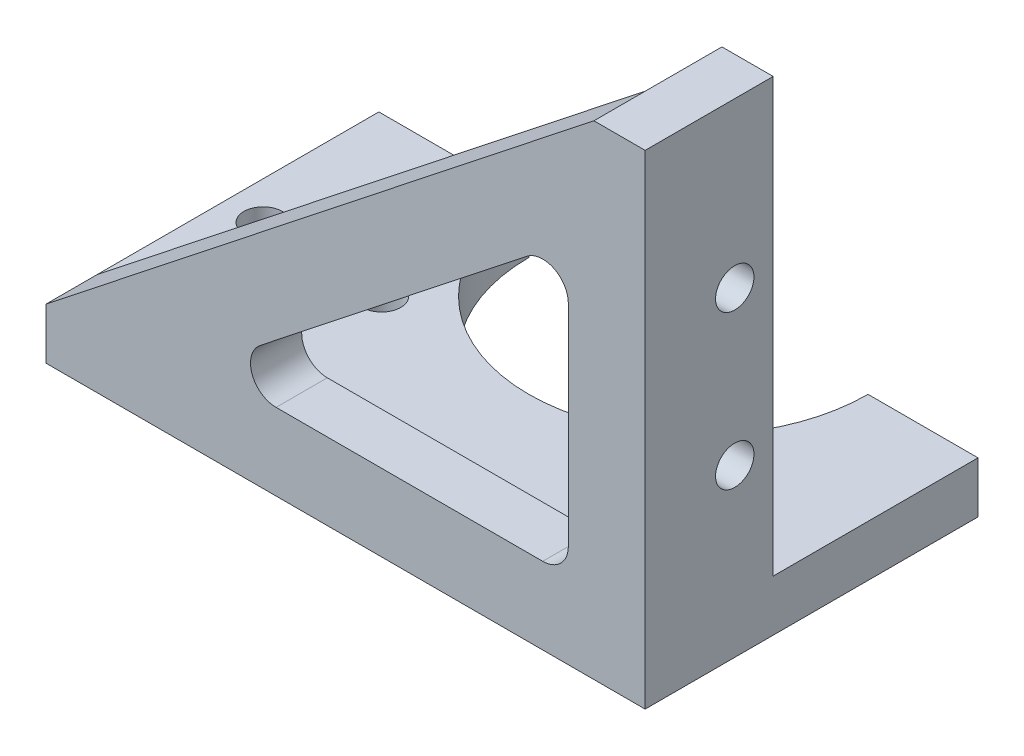
ISO-10303-21;
HEADER;
FILE_DESCRIPTION(('STEP AP214'),'2;1');
FILE_NAME('part.step','',(''),(''),'','','');
FILE_SCHEMA(('AUTOMOTIVE_DESIGN { 1 0 10303 214 1 1 1 1 }'));
ENDSEC;
DATA;
#1=APPLICATION_CONTEXT('core data for automotive mechanical design processes');
#2=APPLICATION_PROTOCOL_DEFINITION('international standard','automotive_design',2000,#1);
#3=PRODUCT_CONTEXT('',#1,'mechanical');
#4=PRODUCT('Part','Part','',(#3));
#5=PRODUCT_RELATED_PRODUCT_CATEGORY('part','',(#4));
#6=PRODUCT_DEFINITION_FORMATION('','',#4);
#7=PRODUCT_DEFINITION_CONTEXT('part definition',#1,'design');
#8=PRODUCT_DEFINITION('design','',#6,#7);
#9=PRODUCT_DEFINITION_SHAPE('','',#8);
#10=(LENGTH_UNIT() NAMED_UNIT(*) SI_UNIT(.MILLI.,.METRE.));
#11=(NAMED_UNIT(*) PLANE_ANGLE_UNIT() SI_UNIT($,.RADIAN.));
#12=(NAMED_UNIT(*) SI_UNIT($,.STERADIAN.) SOLID_ANGLE_UNIT());
#13=UNCERTAINTY_MEASURE_WITH_UNIT(LENGTH_MEASURE(1.E-05),#10,'distance_accuracy_value','');
#14=(GEOMETRIC_REPRESENTATION_CONTEXT(3) GLOBAL_UNCERTAINTY_ASSIGNED_CONTEXT((#13)) GLOBAL_UNIT_ASSIGNED_CONTEXT((#10,
#11,#12)) REPRESENTATION_CONTEXT('',''));
#15=CARTESIAN_POINT('',(0.,0.,0.));
#16=DIRECTION('',(0.,0.,1.));
#17=DIRECTION('',(1.,0.,0.));
#18=AXIS2_PLACEMENT_3D('',#15,#16,#17);
#19=CARTESIAN_POINT('',(0.,0.,0.));
#20=DIRECTION('',(0.,0.,-1.));
#21=DIRECTION('',(-1.,0.,0.));
#22=AXIS2_PLACEMENT_3D('',#19,#20,#21);
#23=PLANE('',#22);
#24=DIRECTION('',(0.,1.,0.));
#25=VECTOR('',#24,1.);
#26=CARTESIAN_POINT('',(-11.69,-2.,0.));
#27=LINE('',#26,#25);
#28=CARTESIAN_POINT('',(-11.69,-2.,0.));
#29=VERTEX_POINT('',#28);
#30=CARTESIAN_POINT('',(-11.69,2.,0.));
#31=VERTEX_POINT('',#30);
#32=EDGE_CURVE('E201',#29,#31,#27,.T.);
#33=ORIENTED_EDGE('',*,*,#32,.F.);
#34=DIRECTION('',(1.,0.,0.));
#35=VECTOR('',#34,1.);
#36=CARTESIAN_POINT('',(23.4,-2.,0.));
#37=LINE('',#36,#35);
#38=CARTESIAN_POINT('',(-23.4,-2.,0.));
#39=VERTEX_POINT('',#38);
#40=EDGE_CURVE('E321',#39,#29,#37,.T.);
#41=ORIENTED_EDGE('',*,*,#40,.F.);
#42=DIRECTION('',(0.,-1.,0.));
#43=VECTOR('',#42,1.);
#44=CARTESIAN_POINT('',(-23.4,-2.,0.));
#45=LINE('',#44,#43);
#46=CARTESIAN_POINT('',(-23.4,2.,0.));
#47=VERTEX_POINT('',#46);
#48=EDGE_CURVE('E311',#47,#39,#45,.T.);
#49=ORIENTED_EDGE('',*,*,#48,.F.);
#50=DIRECTION('',(-1.,0.,0.));
#51=VECTOR('',#50,1.);
#52=CARTESIAN_POINT('',(-16.4,2.,0.));
#53=LINE('',#52,#51);
#54=EDGE_CURVE('E325',#31,#47,#53,.T.);
#55=ORIENTED_EDGE('',*,*,#54,.F.);
#56=EDGE_LOOP('',(#33,#41,#49,#55));
#57=FACE_BOUND('',#56,.T.);
#58=ADVANCED_FACE('F34',(#57),#23,.T.);
#59=CARTESIAN_POINT('',(19.4,35.8,26.));
#60=DIRECTION('',(1.,0.,0.));
#61=DIRECTION('',(0.,1.,0.));
#62=AXIS2_PLACEMENT_3D('',#59,#60,#61);
#63=PLANE('',#62);
#64=CARTESIAN_POINT('',(19.4,23.,19.));
#65=DIRECTION('',(-1.,0.,0.));
#66=DIRECTION('',(0.,-1.,0.));
#67=AXIS2_PLACEMENT_3D('',#64,#65,#66);
#68=CIRCLE('',#67,1.5);
#69=CARTESIAN_POINT('',(19.4,21.5,19.));
#70=VERTEX_POINT('',#69);
#71=EDGE_CURVE('E207',#70,#70,#68,.T.);
#72=ORIENTED_EDGE('',*,*,#71,.F.);
#73=EDGE_LOOP('',(#72));
#74=FACE_BOUND('',#73,.T.);
#75=CARTESIAN_POINT('',(19.4,11.,19.));
#76=DIRECTION('',(-1.,0.,0.));
#77=DIRECTION('',(0.,-1.,0.));
#78=AXIS2_PLACEMENT_3D('',#75,#76,#77);
#79=CIRCLE('',#78,1.5);
#80=CARTESIAN_POINT('',(19.4,9.50000000000001,19.));
#81=VERTEX_POINT('',#80);
#82=EDGE_CURVE('E249',#81,#81,#79,.T.);
#83=ORIENTED_EDGE('',*,*,#82,.F.);
#84=EDGE_LOOP('',(#83));
#85=FACE_BOUND('',#84,.T.);
#86=DIRECTION('',(0.,0.,-1.));
#87=VECTOR('',#86,1.);
#88=CARTESIAN_POINT('',(19.4,35.8,26.));
#89=LINE('',#88,#87);
#90=CARTESIAN_POINT('',(19.4,35.8,22.));
#91=VERTEX_POINT('',#90);
#92=CARTESIAN_POINT('',(19.4,35.8,16.));
#93=VERTEX_POINT('',#92);
#94=EDGE_CURVE('E167',#91,#93,#89,.T.);
#95=ORIENTED_EDGE('',*,*,#94,.T.);
#96=DIRECTION('',(0.,1.,0.));
#97=VECTOR('',#96,1.);
#98=CARTESIAN_POINT('',(19.4,35.8,16.));
#99=LINE('',#98,#97);
#100=CARTESIAN_POINT('',(19.4,2.,16.));
#101=VERTEX_POINT('',#100);
#102=EDGE_CURVE('E150',#101,#93,#99,.T.);
#103=ORIENTED_EDGE('',*,*,#102,.F.);
#104=DIRECTION('',(0.,0.,-1.));
#105=VECTOR('',#104,1.);
#106=CARTESIAN_POINT('',(19.4,2.,26.));
#107=LINE('',#106,#105);
#108=CARTESIAN_POINT('',(19.4,2.,22.));
#109=VERTEX_POINT('',#108);
#110=EDGE_CURVE('E165',#109,#101,#107,.T.);
#111=ORIENTED_EDGE('',*,*,#110,.F.);
#112=DIRECTION('',(0.,1.,0.));
#113=VECTOR('',#112,1.);
#114=CARTESIAN_POINT('',(19.4,35.8,22.));
#115=LINE('',#114,#113);
#116=EDGE_CURVE('E306',#109,#91,#115,.T.);
#117=ORIENTED_EDGE('',*,*,#116,.T.);
#118=EDGE_LOOP('',(#95,#103,#111,#117));
#119=FACE_BOUND('',#118,.T.);
#120=ADVANCED_FACE('F163',(#74,#85,#119),#63,.F.);
#121=CARTESIAN_POINT('',(-16.4,2.,26.));
#122=DIRECTION('',(0.,-1.,0.));
#123=DIRECTION('',(0.,0.,-1.));
#124=AXIS2_PLACEMENT_3D('',#121,#122,#123);
#125=PLANE('',#124);
#126=CARTESIAN_POINT('',(-20.44,2.,12.));
#127=DIRECTION('',(0.,1.,0.));
#128=DIRECTION('',(-1.,0.,0.));
#129=AXIS2_PLACEMENT_3D('',#126,#127,#128);
#130=CIRCLE('',#129,1.5);
#131=CARTESIAN_POINT('',(-21.94,2.,12.));
#132=VERTEX_POINT('',#131);
#133=EDGE_CURVE('E286',#132,#132,#130,.T.);
#134=ORIENTED_EDGE('',*,*,#133,.F.);
#135=EDGE_LOOP('',(#134));
#136=FACE_BOUND('',#135,.T.);
#137=CARTESIAN_POINT('',(13.9343686707647,2.,12.3743686707644));
#138=DIRECTION('',(0.,1.,0.));
#139=DIRECTION('',(-1.,0.,0.));
#140=AXIS2_PLACEMENT_3D('',#137,#138,#139);
#141=CIRCLE('',#140,1.5);
#142=CARTESIAN_POINT('',(12.4343686707647,2.,12.3743686707644));
#143=VERTEX_POINT('',#142);
#144=EDGE_CURVE('E299',#143,#143,#141,.T.);
#145=ORIENTED_EDGE('',*,*,#144,.F.);
#146=EDGE_LOOP('',(#145));
#147=FACE_BOUND('',#146,.T.);
#148=CARTESIAN_POINT('',(-10.8143686707644,2.,12.3743686707647));
#149=DIRECTION('',(0.,1.,0.));
#150=DIRECTION('',(-1.,0.,0.));
#151=AXIS2_PLACEMENT_3D('',#148,#149,#150);
#152=CIRCLE('',#151,1.5);
#153=CARTESIAN_POINT('',(-12.3143686707644,2.,12.3743686707647));
#154=VERTEX_POINT('',#153);
#155=EDGE_CURVE('E281',#154,#154,#152,.T.);
#156=ORIENTED_EDGE('',*,*,#155,.F.);
#157=EDGE_LOOP('',(#156));
#158=FACE_BOUND('',#157,.T.);
#159=CARTESIAN_POINT('',(23.4,2.00000000000001,0.));
#160=VERTEX_POINT('',#159);
#161=CARTESIAN_POINT('',(14.81,2.,0.));
#162=VERTEX_POINT('',#161);
#163=EDGE_CURVE('E183',#160,#162,#53,.T.);
#164=ORIENTED_EDGE('',*,*,#163,.T.);
#165=CARTESIAN_POINT('',(1.55999999999998,2.,0.));
#166=DIRECTION('',(0.,1.,0.));
#167=DIRECTION('',(-1.,0.,0.));
#168=AXIS2_PLACEMENT_3D('',#165,#166,#167);
#169=CIRCLE('',#168,13.25);
#170=EDGE_CURVE('E293',#31,#162,#169,.T.);
#171=ORIENTED_EDGE('',*,*,#170,.F.);
#172=ORIENTED_EDGE('',*,*,#54,.T.);
#173=DIRECTION('',(0.,0.,-1.));
#174=VECTOR('',#173,1.);
#175=CARTESIAN_POINT('',(-23.4,2.,26.));
#176=LINE('',#175,#174);
#177=CARTESIAN_POINT('',(-23.4,2.,22.));
#178=VERTEX_POINT('',#177);
#179=EDGE_CURVE('E195',#178,#47,#176,.T.);
#180=ORIENTED_EDGE('',*,*,#179,.F.);
#181=DIRECTION('',(1.,0.,0.));
#182=VECTOR('',#181,1.);
#183=CARTESIAN_POINT('',(19.4,2.,22.));
#184=LINE('',#183,#182);
#185=EDGE_CURVE('E174',#178,#109,#184,.T.);
#186=ORIENTED_EDGE('',*,*,#185,.T.);
#187=ORIENTED_EDGE('',*,*,#110,.T.);
#188=DIRECTION('',(-1.,0.,0.));
#189=VECTOR('',#188,1.);
#190=CARTESIAN_POINT('',(29.4,2.00000000000001,16.));
#191=LINE('',#190,#189);
#192=CARTESIAN_POINT('',(23.4,2.,16.));
#193=VERTEX_POINT('',#192);
#194=EDGE_CURVE('E147',#193,#101,#191,.T.);
#195=ORIENTED_EDGE('',*,*,#194,.F.);
#196=DIRECTION('',(0.,0.,1.));
#197=VECTOR('',#196,1.);
#198=CARTESIAN_POINT('',(23.4,2.00000000000001,26.));
#199=LINE('',#198,#197);
#200=EDGE_CURVE('E277',#160,#193,#199,.T.);
#201=ORIENTED_EDGE('',*,*,#200,.F.);
#202=EDGE_LOOP('',(#164,#171,#172,#180,#186,#187,#195,#201));
#203=FACE_BOUND('',#202,.T.);
#204=ADVANCED_FACE('F172',(#136,#147,#158,#203),#125,.F.);
#205=CARTESIAN_POINT('',(-23.4,-2.,26.));
#206=DIRECTION('',(1.,0.,0.));
#207=DIRECTION('',(0.,0.,-1.));
#208=AXIS2_PLACEMENT_3D('',#205,#206,#207);
#209=PLANE('',#208);
#210=ORIENTED_EDGE('',*,*,#48,.T.);
#211=DIRECTION('',(0.,0.,-1.));
#212=VECTOR('',#211,1.);
#213=CARTESIAN_POINT('',(-23.4,-2.,26.));
#214=LINE('',#213,#212);
#215=CARTESIAN_POINT('',(-23.4,-2.,26.));
#216=VERTEX_POINT('',#215);
#217=EDGE_CURVE('E192',#216,#39,#214,.T.);
#218=ORIENTED_EDGE('',*,*,#217,.F.);
#219=DIRECTION('',(0.,-1.,0.));
#220=VECTOR('',#219,1.);
#221=CARTESIAN_POINT('',(-23.4,-2.,26.));
#222=LINE('',#221,#220);
#223=CARTESIAN_POINT('',(-23.4,2.,26.));
#224=VERTEX_POINT('',#223);
#225=EDGE_CURVE('E314',#224,#216,#222,.T.);
#226=ORIENTED_EDGE('',*,*,#225,.F.);
#227=EDGE_CURVE('E196',#224,#178,#176,.T.);
#228=ORIENTED_EDGE('',*,*,#227,.T.);
#229=ORIENTED_EDGE('',*,*,#179,.T.);
#230=EDGE_LOOP('',(#210,#218,#226,#228,#229));
#231=FACE_BOUND('',#230,.T.);
#232=ADVANCED_FACE('F347',(#231),#209,.F.);
#233=CARTESIAN_POINT('',(23.4,-2.,26.));
#234=DIRECTION('',(0.,1.,0.));
#235=DIRECTION('',(-1.,0.,0.));
#236=AXIS2_PLACEMENT_3D('',#233,#234,#235);
#237=PLANE('',#236);
#238=CARTESIAN_POINT('',(-20.44,-2.,12.));
#239=DIRECTION('',(0.,1.,0.));
#240=DIRECTION('',(-1.,0.,0.));
#241=AXIS2_PLACEMENT_3D('',#238,#239,#240);
#242=CIRCLE('',#241,1.5);
#243=CARTESIAN_POINT('',(-21.94,-2.,12.));
#244=VERTEX_POINT('',#243);
#245=EDGE_CURVE('E282',#244,#244,#242,.T.);
#246=ORIENTED_EDGE('',*,*,#245,.T.);
#247=EDGE_LOOP('',(#246));
#248=FACE_BOUND('',#247,.T.);
#249=CARTESIAN_POINT('',(13.9343686707647,-2.,12.3743686707644));
#250=DIRECTION('',(0.,1.,0.));
#251=DIRECTION('',(-1.,0.,0.));
#252=AXIS2_PLACEMENT_3D('',#249,#250,#251);
#253=CIRCLE('',#252,1.5);
#254=CARTESIAN_POINT('',(12.4343686707647,-2.,12.3743686707644));
#255=VERTEX_POINT('',#254);
#256=EDGE_CURVE('E289',#255,#255,#253,.T.);
#257=ORIENTED_EDGE('',*,*,#256,.T.);
#258=EDGE_LOOP('',(#257));
#259=FACE_BOUND('',#258,.T.);
#260=CARTESIAN_POINT('',(-10.8143686707644,-2.,12.3743686707647));
#261=DIRECTION('',(0.,1.,0.));
#262=DIRECTION('',(-1.,0.,0.));
#263=AXIS2_PLACEMENT_3D('',#260,#261,#262);
#264=CIRCLE('',#263,1.5);
#265=CARTESIAN_POINT('',(-12.3143686707644,-2.,12.3743686707647));
#266=VERTEX_POINT('',#265);
#267=EDGE_CURVE('E290',#266,#266,#264,.T.);
#268=ORIENTED_EDGE('',*,*,#267,.T.);
#269=EDGE_LOOP('',(#268));
#270=FACE_BOUND('',#269,.T.);
#271=ORIENTED_EDGE('',*,*,#40,.T.);
#272=CARTESIAN_POINT('',(1.55999999999998,-2.,0.));
#273=DIRECTION('',(0.,1.,0.));
#274=DIRECTION('',(-1.,0.,0.));
#275=AXIS2_PLACEMENT_3D('',#272,#273,#274);
#276=CIRCLE('',#275,13.25);
#277=CARTESIAN_POINT('',(14.81,-2.,0.));
#278=VERTEX_POINT('',#277);
#279=EDGE_CURVE('E296',#29,#278,#276,.T.);
#280=ORIENTED_EDGE('',*,*,#279,.T.);
#281=CARTESIAN_POINT('',(23.4,-2.,0.));
#282=VERTEX_POINT('',#281);
#283=EDGE_CURVE('E320',#278,#282,#37,.T.);
#284=ORIENTED_EDGE('',*,*,#283,.T.);
#285=DIRECTION('',(0.,0.,-1.));
#286=VECTOR('',#285,1.);
#287=CARTESIAN_POINT('',(23.4,-2.,26.));
#288=LINE('',#287,#286);
#289=CARTESIAN_POINT('',(23.4,-2.,26.));
#290=VERTEX_POINT('',#289);
#291=EDGE_CURVE('E189',#290,#282,#288,.T.);
#292=ORIENTED_EDGE('',*,*,#291,.F.);
#293=DIRECTION('',(1.,0.,0.));
#294=VECTOR('',#293,1.);
#295=CARTESIAN_POINT('',(23.4,-2.,26.));
#296=LINE('',#295,#294);
#297=EDGE_CURVE('E316',#216,#290,#296,.T.);
#298=ORIENTED_EDGE('',*,*,#297,.F.);
#299=ORIENTED_EDGE('',*,*,#217,.T.);
#300=EDGE_LOOP('',(#271,#280,#284,#292,#298,#299));
#301=FACE_BOUND('',#300,.T.);
#302=ADVANCED_FACE('F339',(#248,#259,#270,#301),#237,.F.);
#303=CARTESIAN_POINT('',(23.4,21.7284271247462,26.));
#304=DIRECTION('',(-1.,0.,0.));
#305=DIRECTION('',(0.,0.,1.));
#306=AXIS2_PLACEMENT_3D('',#303,#304,#305);
#307=PLANE('',#306);
#308=CARTESIAN_POINT('',(23.4,23.,19.));
#309=DIRECTION('',(-1.,0.,0.));
#310=DIRECTION('',(0.,0.,1.));
#311=AXIS2_PLACEMENT_3D('',#308,#309,#310);
#312=CIRCLE('',#311,1.5);
#313=CARTESIAN_POINT('',(23.4,23.,20.5));
#314=VERTEX_POINT('',#313);
#315=EDGE_CURVE('E168',#314,#314,#312,.T.);
#316=ORIENTED_EDGE('',*,*,#315,.T.);
#317=EDGE_LOOP('',(#316));
#318=FACE_BOUND('',#317,.T.);
#319=CARTESIAN_POINT('',(23.4,11.,19.));
#320=DIRECTION('',(-1.,0.,0.));
#321=DIRECTION('',(0.,0.,1.));
#322=AXIS2_PLACEMENT_3D('',#319,#320,#321);
#323=CIRCLE('',#322,1.5);
#324=CARTESIAN_POINT('',(23.4,11.,20.5));
#325=VERTEX_POINT('',#324);
#326=EDGE_CURVE('E204',#325,#325,#323,.T.);
#327=ORIENTED_EDGE('',*,*,#326,.T.);
#328=EDGE_LOOP('',(#327));
#329=FACE_BOUND('',#328,.T.);
#330=ORIENTED_EDGE('',*,*,#200,.T.);
#331=DIRECTION('',(0.,1.,0.));
#332=VECTOR('',#331,1.);
#333=CARTESIAN_POINT('',(23.4,21.7284271247462,16.));
#334=LINE('',#333,#332);
#335=CARTESIAN_POINT('',(23.4,35.8,16.));
#336=VERTEX_POINT('',#335);
#337=EDGE_CURVE('E153',#193,#336,#334,.T.);
#338=ORIENTED_EDGE('',*,*,#337,.T.);
#339=DIRECTION('',(0.,0.,-1.));
#340=VECTOR('',#339,1.);
#341=CARTESIAN_POINT('',(23.4,35.8,26.));
#342=LINE('',#341,#340);
#343=CARTESIAN_POINT('',(23.4,35.8,26.));
#344=VERTEX_POINT('',#343);
#345=EDGE_CURVE('E186',#344,#336,#342,.T.);
#346=ORIENTED_EDGE('',*,*,#345,.F.);
#347=DIRECTION('',(0.,1.,0.));
#348=VECTOR('',#347,1.);
#349=CARTESIAN_POINT('',(23.4,-2.,26.));
#350=LINE('',#349,#348);
#351=EDGE_CURVE('E180',#290,#344,#350,.T.);
#352=ORIENTED_EDGE('',*,*,#351,.F.);
#353=ORIENTED_EDGE('',*,*,#291,.T.);
#354=DIRECTION('',(0.,1.,0.));
#355=VECTOR('',#354,1.);
#356=CARTESIAN_POINT('',(23.4,21.7284271247462,0.));
#357=LINE('',#356,#355);
#358=EDGE_CURVE('E323',#282,#160,#357,.T.);
#359=ORIENTED_EDGE('',*,*,#358,.T.);
#360=EDGE_LOOP('',(#330,#338,#346,#352,#353,#359));
#361=FACE_BOUND('',#360,.T.);
#362=ADVANCED_FACE('F384',(#318,#329,#361),#307,.F.);
#363=CARTESIAN_POINT('',(23.4,35.8,26.));
#364=DIRECTION('',(0.,-1.,0.));
#365=DIRECTION('',(1.,0.,0.));
#366=AXIS2_PLACEMENT_3D('',#363,#364,#365);
#367=PLANE('',#366);
#368=ORIENTED_EDGE('',*,*,#345,.T.);
#369=DIRECTION('',(-1.,0.,0.));
#370=VECTOR('',#369,1.);
#371=CARTESIAN_POINT('',(29.4,35.8,16.));
#372=LINE('',#371,#370);
#373=EDGE_CURVE('E158',#336,#93,#372,.T.);
#374=ORIENTED_EDGE('',*,*,#373,.T.);
#375=ORIENTED_EDGE('',*,*,#94,.F.);
#376=CARTESIAN_POINT('',(19.4,35.8,26.));
#377=VERTEX_POINT('',#376);
#378=EDGE_CURVE('E177',#377,#91,#89,.T.);
#379=ORIENTED_EDGE('',*,*,#378,.F.);
#380=DIRECTION('',(-1.,0.,0.));
#381=VECTOR('',#380,1.);
#382=CARTESIAN_POINT('',(23.4,35.8,26.));
#383=LINE('',#382,#381);
#384=EDGE_CURVE('E175',#344,#377,#383,.T.);
#385=ORIENTED_EDGE('',*,*,#384,.F.);
#386=EDGE_LOOP('',(#368,#374,#375,#379,#385));
#387=FACE_BOUND('',#386,.T.);
#388=ADVANCED_FACE('F357',(#387),#367,.F.);
#389=CARTESIAN_POINT('',(0.,0.,26.));
#390=DIRECTION('',(0.,0.,-1.));
#391=DIRECTION('',(-1.,0.,0.));
#392=AXIS2_PLACEMENT_3D('',#389,#390,#391);
#393=PLANE('',#392);
#394=DIRECTION('',(1.,0.,0.));
#395=VECTOR('',#394,1.);
#396=CARTESIAN_POINT('',(17.4,4.,26.));
#397=LINE('',#396,#395);
#398=CARTESIAN_POINT('',(-5.42675504269587,4.,26.));
#399=VERTEX_POINT('',#398);
#400=CARTESIAN_POINT('',(15.4,4.,26.));
#401=VERTEX_POINT('',#400);
#402=EDGE_CURVE('E250',#399,#401,#397,.T.);
#403=ORIENTED_EDGE('',*,*,#402,.F.);
#404=CARTESIAN_POINT('',(-5.42675504269587,6.,26.));
#405=DIRECTION('',(0.,0.,-1.));
#406=DIRECTION('',(-1.,0.,0.));
#407=AXIS2_PLACEMENT_3D('',#404,#405,#406);
#408=CIRCLE('',#407,2.);
#409=CARTESIAN_POINT('',(-6.6662814128613,7.56957777050533,26.));
#410=VERTEX_POINT('',#409);
#411=EDGE_CURVE('E230',#399,#410,#408,.T.);
#412=ORIENTED_EDGE('',*,*,#411,.T.);
#413=DIRECTION('',(-0.784788885252669,-0.619763185082716,0.));
#414=VECTOR('',#413,1.);
#415=CARTESIAN_POINT('',(-11.186338471371,3.99999999999999,26.));
#416=LINE('',#415,#414);
#417=CARTESIAN_POINT('',(14.1604736298346,24.0168749771203,26.));
#418=VERTEX_POINT('',#417);
#419=EDGE_CURVE('E244',#418,#410,#416,.T.);
#420=ORIENTED_EDGE('',*,*,#419,.F.);
#421=CARTESIAN_POINT('',(15.4,22.447297206615,26.));
#422=DIRECTION('',(0.,0.,-1.));
#423=DIRECTION('',(-1.,0.,0.));
#424=AXIS2_PLACEMENT_3D('',#421,#422,#423);
#425=CIRCLE('',#424,2.);
#426=CARTESIAN_POINT('',(17.4,22.447297206615,26.));
#427=VERTEX_POINT('',#426);
#428=EDGE_CURVE('E42',#418,#427,#425,.T.);
#429=ORIENTED_EDGE('',*,*,#428,.T.);
#430=DIRECTION('',(0.,1.,0.));
#431=VECTOR('',#430,1.);
#432=CARTESIAN_POINT('',(17.4,26.5751925311294,26.));
#433=LINE('',#432,#431);
#434=CARTESIAN_POINT('',(17.4,6.,26.));
#435=VERTEX_POINT('',#434);
#436=EDGE_CURVE('E242',#435,#427,#433,.T.);
#437=ORIENTED_EDGE('',*,*,#436,.F.);
#438=CARTESIAN_POINT('',(15.4,6.,26.));
#439=DIRECTION('',(0.,0.,-1.));
#440=DIRECTION('',(-1.,0.,0.));
#441=AXIS2_PLACEMENT_3D('',#438,#439,#440);
#442=CIRCLE('',#441,2.);
#443=EDGE_CURVE('E234',#435,#401,#442,.T.);
#444=ORIENTED_EDGE('',*,*,#443,.T.);
#445=EDGE_LOOP('',(#403,#412,#420,#429,#437,#444));
#446=FACE_BOUND('',#445,.T.);
#447=DIRECTION('',(-0.784788885252669,-0.619763185082716,0.));
#448=VECTOR('',#447,1.);
#449=CARTESIAN_POINT('',(19.4,35.8,26.));
#450=LINE('',#449,#448);
#451=EDGE_CURVE('E285',#377,#224,#450,.T.);
#452=ORIENTED_EDGE('',*,*,#451,.T.);
#453=ORIENTED_EDGE('',*,*,#225,.T.);
#454=ORIENTED_EDGE('',*,*,#297,.T.);
#455=ORIENTED_EDGE('',*,*,#351,.T.);
#456=ORIENTED_EDGE('',*,*,#384,.T.);
#457=EDGE_LOOP('',(#452,#453,#454,#455,#456));
#458=FACE_BOUND('',#457,.T.);
#459=ADVANCED_FACE('F240',(#446,#458),#393,.F.);
#460=ORIENTED_EDGE('',*,*,#163,.F.);
#461=ORIENTED_EDGE('',*,*,#358,.F.);
#462=ORIENTED_EDGE('',*,*,#283,.F.);
#463=DIRECTION('',(0.,1.,0.));
#464=VECTOR('',#463,1.);
#465=CARTESIAN_POINT('',(14.81,-2.,0.));
#466=LINE('',#465,#464);
#467=EDGE_CURVE('E199',#162,#278,#466,.F.);
#468=ORIENTED_EDGE('',*,*,#467,.F.);
#469=EDGE_LOOP('',(#460,#461,#462,#468));
#470=FACE_BOUND('',#469,.T.);
#471=ADVANCED_FACE('F333',(#470),#23,.T.);
#472=CARTESIAN_POINT('',(19.4,35.8,22.));
#473=DIRECTION('',(-0.619763185082716,0.784788885252669,0.));
#474=DIRECTION('',(-0.784788885252669,-0.619763185082716,0.));
#475=AXIS2_PLACEMENT_3D('',#472,#473,#474);
#476=PLANE('',#475);
#477=ORIENTED_EDGE('',*,*,#451,.F.);
#478=ORIENTED_EDGE('',*,*,#378,.T.);
#479=DIRECTION('',(-0.784788885252669,-0.619763185082716,0.));
#480=VECTOR('',#479,1.);
#481=CARTESIAN_POINT('',(19.4,35.8,22.));
#482=LINE('',#481,#480);
#483=EDGE_CURVE('E308',#91,#178,#482,.T.);
#484=ORIENTED_EDGE('',*,*,#483,.T.);
#485=ORIENTED_EDGE('',*,*,#227,.F.);
#486=EDGE_LOOP('',(#477,#478,#484,#485));
#487=FACE_BOUND('',#486,.T.);
#488=ADVANCED_FACE('F350',(#487),#476,.T.);
#489=CARTESIAN_POINT('',(0.,0.,22.));
#490=DIRECTION('',(0.,0.,1.));
#491=DIRECTION('',(1.,0.,0.));
#492=AXIS2_PLACEMENT_3D('',#489,#490,#491);
#493=PLANE('',#492);
#494=DIRECTION('',(1.,0.,0.));
#495=VECTOR('',#494,1.);
#496=CARTESIAN_POINT('',(0.,4.,22.));
#497=LINE('',#496,#495);
#498=CARTESIAN_POINT('',(-5.42675504269587,4.,22.));
#499=VERTEX_POINT('',#498);
#500=CARTESIAN_POINT('',(15.4,4.,22.));
#501=VERTEX_POINT('',#500);
#502=EDGE_CURVE('E203',#499,#501,#497,.T.);
#503=ORIENTED_EDGE('',*,*,#502,.T.);
#504=CARTESIAN_POINT('',(15.4,6.,22.));
#505=DIRECTION('',(0.,0.,1.));
#506=DIRECTION('',(1.,0.,0.));
#507=AXIS2_PLACEMENT_3D('',#504,#505,#506);
#508=CIRCLE('',#507,2.);
#509=CARTESIAN_POINT('',(17.4,6.,22.));
#510=VERTEX_POINT('',#509);
#511=EDGE_CURVE('E56',#501,#510,#508,.T.);
#512=ORIENTED_EDGE('',*,*,#511,.T.);
#513=DIRECTION('',(0.,1.,0.));
#514=VECTOR('',#513,1.);
#515=CARTESIAN_POINT('',(17.4,0.,22.));
#516=LINE('',#515,#514);
#517=CARTESIAN_POINT('',(17.4,22.447297206615,22.));
#518=VERTEX_POINT('',#517);
#519=EDGE_CURVE('E211',#510,#518,#516,.T.);
#520=ORIENTED_EDGE('',*,*,#519,.T.);
#521=CARTESIAN_POINT('',(15.4,22.447297206615,22.));
#522=DIRECTION('',(0.,0.,1.));
#523=DIRECTION('',(1.,0.,0.));
#524=AXIS2_PLACEMENT_3D('',#521,#522,#523);
#525=CIRCLE('',#524,2.);
#526=CARTESIAN_POINT('',(14.1604736298346,24.0168749771203,22.));
#527=VERTEX_POINT('',#526);
#528=EDGE_CURVE('E11',#518,#527,#525,.T.);
#529=ORIENTED_EDGE('',*,*,#528,.T.);
#530=DIRECTION('',(-0.784788885252669,-0.619763185082716,0.));
#531=VECTOR('',#530,1.);
#532=CARTESIAN_POINT('',(-6.24227729844974,7.90442214123222,22.));
#533=LINE('',#532,#531);
#534=CARTESIAN_POINT('',(-6.6662814128613,7.56957777050533,22.));
#535=VERTEX_POINT('',#534);
#536=EDGE_CURVE('E213',#527,#535,#533,.T.);
#537=ORIENTED_EDGE('',*,*,#536,.T.);
#538=CARTESIAN_POINT('',(-5.42675504269587,6.,22.));
#539=DIRECTION('',(0.,0.,1.));
#540=DIRECTION('',(1.,0.,0.));
#541=AXIS2_PLACEMENT_3D('',#538,#539,#540);
#542=CIRCLE('',#541,2.);
#543=EDGE_CURVE('E232',#535,#499,#542,.T.);
#544=ORIENTED_EDGE('',*,*,#543,.T.);
#545=EDGE_LOOP('',(#503,#512,#520,#529,#537,#544));
#546=FACE_BOUND('',#545,.T.);
#547=ORIENTED_EDGE('',*,*,#185,.F.);
#548=ORIENTED_EDGE('',*,*,#483,.F.);
#549=ORIENTED_EDGE('',*,*,#116,.F.);
#550=EDGE_LOOP('',(#547,#548,#549));
#551=FACE_BOUND('',#550,.T.);
#552=ADVANCED_FACE('F254',(#546,#551),#493,.F.);
#553=CARTESIAN_POINT('',(1.55999999999998,-2.,0.));
#554=DIRECTION('',(0.,1.,0.));
#555=DIRECTION('',(-1.,0.,0.));
#556=AXIS2_PLACEMENT_3D('',#553,#554,#555);
#557=CYLINDRICAL_SURFACE('',#556,13.25);
#558=ORIENTED_EDGE('',*,*,#32,.T.);
#559=ORIENTED_EDGE('',*,*,#170,.T.);
#560=ORIENTED_EDGE('',*,*,#467,.T.);
#561=ORIENTED_EDGE('',*,*,#279,.F.);
#562=EDGE_LOOP('',(#558,#559,#560,#561));
#563=FACE_BOUND('',#562,.T.);
#564=ADVANCED_FACE('F336',(#563),#557,.F.);
#565=CARTESIAN_POINT('',(-10.8143686707644,-2.,12.3743686707647));
#566=DIRECTION('',(0.,1.,0.));
#567=DIRECTION('',(-1.,0.,0.));
#568=AXIS2_PLACEMENT_3D('',#565,#566,#567);
#569=CYLINDRICAL_SURFACE('',#568,1.5);
#570=ORIENTED_EDGE('',*,*,#267,.F.);
#571=EDGE_LOOP('',(#570));
#572=FACE_BOUND('',#571,.T.);
#573=ORIENTED_EDGE('',*,*,#155,.T.);
#574=EDGE_LOOP('',(#573));
#575=FACE_BOUND('',#574,.T.);
#576=ADVANCED_FACE('F364',(#572,#575),#569,.F.);
#577=CARTESIAN_POINT('',(13.9343686707647,-2.,12.3743686707644));
#578=DIRECTION('',(0.,1.,0.));
#579=DIRECTION('',(-1.,0.,0.));
#580=AXIS2_PLACEMENT_3D('',#577,#578,#579);
#581=CYLINDRICAL_SURFACE('',#580,1.5);
#582=ORIENTED_EDGE('',*,*,#256,.F.);
#583=EDGE_LOOP('',(#582));
#584=FACE_BOUND('',#583,.T.);
#585=ORIENTED_EDGE('',*,*,#144,.T.);
#586=EDGE_LOOP('',(#585));
#587=FACE_BOUND('',#586,.T.);
#588=ADVANCED_FACE('F518',(#584,#587),#581,.F.);
#589=CARTESIAN_POINT('',(-20.44,-2.,12.));
#590=DIRECTION('',(0.,1.,0.));
#591=DIRECTION('',(-1.,0.,0.));
#592=AXIS2_PLACEMENT_3D('',#589,#590,#591);
#593=CYLINDRICAL_SURFACE('',#592,1.5);
#594=ORIENTED_EDGE('',*,*,#245,.F.);
#595=EDGE_LOOP('',(#594));
#596=FACE_BOUND('',#595,.T.);
#597=ORIENTED_EDGE('',*,*,#133,.T.);
#598=EDGE_LOOP('',(#597));
#599=FACE_BOUND('',#598,.T.);
#600=ADVANCED_FACE('F493',(#596,#599),#593,.F.);
#601=CARTESIAN_POINT('',(29.4,35.8,16.));
#602=DIRECTION('',(0.,0.,1.));
#603=DIRECTION('',(0.,-1.,0.));
#604=AXIS2_PLACEMENT_3D('',#601,#602,#603);
#605=PLANE('',#604);
#606=ORIENTED_EDGE('',*,*,#194,.T.);
#607=ORIENTED_EDGE('',*,*,#102,.T.);
#608=ORIENTED_EDGE('',*,*,#373,.F.);
#609=ORIENTED_EDGE('',*,*,#337,.F.);
#610=EDGE_LOOP('',(#606,#607,#608,#609));
#611=FACE_BOUND('',#610,.T.);
#612=ADVANCED_FACE('F149',(#611),#605,.F.);
#613=CARTESIAN_POINT('',(29.4,11.,19.));
#614=DIRECTION('',(-1.,0.,0.));
#615=DIRECTION('',(0.,-1.,0.));
#616=AXIS2_PLACEMENT_3D('',#613,#614,#615);
#617=CYLINDRICAL_SURFACE('',#616,1.5);
#618=ORIENTED_EDGE('',*,*,#82,.T.);
#619=EDGE_LOOP('',(#618));
#620=FACE_BOUND('',#619,.T.);
#621=ORIENTED_EDGE('',*,*,#326,.F.);
#622=EDGE_LOOP('',(#621));
#623=FACE_BOUND('',#622,.T.);
#624=ADVANCED_FACE('F460',(#620,#623),#617,.F.);
#625=CARTESIAN_POINT('',(29.4,23.,19.));
#626=DIRECTION('',(-1.,0.,0.));
#627=DIRECTION('',(0.,-1.,0.));
#628=AXIS2_PLACEMENT_3D('',#625,#626,#627);
#629=CYLINDRICAL_SURFACE('',#628,1.5);
#630=ORIENTED_EDGE('',*,*,#71,.T.);
#631=EDGE_LOOP('',(#630));
#632=FACE_BOUND('',#631,.T.);
#633=ORIENTED_EDGE('',*,*,#315,.F.);
#634=EDGE_LOOP('',(#633));
#635=FACE_BOUND('',#634,.T.);
#636=ADVANCED_FACE('F438',(#632,#635),#629,.F.);
#637=CARTESIAN_POINT('',(-11.186338471371,3.99999999999999,16.));
#638=DIRECTION('',(-0.619763185082716,0.784788885252669,0.));
#639=DIRECTION('',(-0.784788885252669,-0.619763185082716,0.));
#640=AXIS2_PLACEMENT_3D('',#637,#638,#639);
#641=PLANE('',#640);
#642=ORIENTED_EDGE('',*,*,#419,.T.);
#643=DIRECTION('',(0.,0.,1.));
#644=VECTOR('',#643,1.);
#645=CARTESIAN_POINT('',(-6.6662814128613,7.56957777050533,22.));
#646=LINE('',#645,#644);
#647=EDGE_CURVE('E224',#410,#535,#646,.F.);
#648=ORIENTED_EDGE('',*,*,#647,.T.);
#649=ORIENTED_EDGE('',*,*,#536,.F.);
#650=DIRECTION('',(0.,0.,1.));
#651=VECTOR('',#650,1.);
#652=CARTESIAN_POINT('',(14.1604736298346,24.0168749771203,26.));
#653=LINE('',#652,#651);
#654=EDGE_CURVE('E221',#527,#418,#653,.T.);
#655=ORIENTED_EDGE('',*,*,#654,.T.);
#656=EDGE_LOOP('',(#642,#648,#649,#655));
#657=FACE_BOUND('',#656,.T.);
#658=ADVANCED_FACE('F258',(#657),#641,.F.);
#659=CARTESIAN_POINT('',(17.4,26.5751925311294,16.));
#660=DIRECTION('',(1.,0.,0.));
#661=DIRECTION('',(0.,1.,0.));
#662=AXIS2_PLACEMENT_3D('',#659,#660,#661);
#663=PLANE('',#662);
#664=ORIENTED_EDGE('',*,*,#519,.F.);
#665=DIRECTION('',(0.,0.,1.));
#666=VECTOR('',#665,1.);
#667=CARTESIAN_POINT('',(17.4,6.,26.));
#668=LINE('',#667,#666);
#669=EDGE_CURVE('E227',#510,#435,#668,.T.);
#670=ORIENTED_EDGE('',*,*,#669,.T.);
#671=ORIENTED_EDGE('',*,*,#436,.T.);
#672=DIRECTION('',(0.,0.,1.));
#673=VECTOR('',#672,1.);
#674=CARTESIAN_POINT('',(17.4,22.447297206615,22.));
#675=LINE('',#674,#673);
#676=EDGE_CURVE('E49',#427,#518,#675,.F.);
#677=ORIENTED_EDGE('',*,*,#676,.T.);
#678=EDGE_LOOP('',(#664,#670,#671,#677));
#679=FACE_BOUND('',#678,.T.);
#680=ADVANCED_FACE('F247',(#679),#663,.F.);
#681=CARTESIAN_POINT('',(17.4,4.,16.));
#682=DIRECTION('',(0.,-1.,0.));
#683=DIRECTION('',(1.,0.,0.));
#684=AXIS2_PLACEMENT_3D('',#681,#682,#683);
#685=PLANE('',#684);
#686=ORIENTED_EDGE('',*,*,#502,.F.);
#687=DIRECTION('',(0.,0.,1.));
#688=VECTOR('',#687,1.);
#689=CARTESIAN_POINT('',(-5.42675504269587,4.,26.));
#690=LINE('',#689,#688);
#691=EDGE_CURVE('E218',#499,#399,#690,.T.);
#692=ORIENTED_EDGE('',*,*,#691,.T.);
#693=ORIENTED_EDGE('',*,*,#402,.T.);
#694=DIRECTION('',(0.,0.,1.));
#695=VECTOR('',#694,1.);
#696=CARTESIAN_POINT('',(15.4,4.,22.));
#697=LINE('',#696,#695);
#698=EDGE_CURVE('E216',#401,#501,#697,.F.);
#699=ORIENTED_EDGE('',*,*,#698,.T.);
#700=EDGE_LOOP('',(#686,#692,#693,#699));
#701=FACE_BOUND('',#700,.T.);
#702=ADVANCED_FACE('F265',(#701),#685,.F.);
#703=CARTESIAN_POINT('',(-5.42675504269587,6.,16.));
#704=DIRECTION('',(0.,0.,-1.));
#705=DIRECTION('',(-1.,0.,0.));
#706=AXIS2_PLACEMENT_3D('',#703,#704,#705);
#707=CYLINDRICAL_SURFACE('',#706,2.);
#708=ORIENTED_EDGE('',*,*,#543,.F.);
#709=ORIENTED_EDGE('',*,*,#647,.F.);
#710=ORIENTED_EDGE('',*,*,#411,.F.);
#711=ORIENTED_EDGE('',*,*,#691,.F.);
#712=EDGE_LOOP('',(#708,#709,#710,#711));
#713=FACE_BOUND('',#712,.T.);
#714=ADVANCED_FACE('F261',(#713),#707,.F.);
#715=CARTESIAN_POINT('',(15.4,6.,16.));
#716=DIRECTION('',(0.,0.,-1.));
#717=DIRECTION('',(-1.,0.,0.));
#718=AXIS2_PLACEMENT_3D('',#715,#716,#717);
#719=CYLINDRICAL_SURFACE('',#718,2.);
#720=ORIENTED_EDGE('',*,*,#511,.F.);
#721=ORIENTED_EDGE('',*,*,#698,.F.);
#722=ORIENTED_EDGE('',*,*,#443,.F.);
#723=ORIENTED_EDGE('',*,*,#669,.F.);
#724=EDGE_LOOP('',(#720,#721,#722,#723));
#725=FACE_BOUND('',#724,.T.);
#726=ADVANCED_FACE('F269',(#725),#719,.F.);
#727=CARTESIAN_POINT('',(15.4,22.447297206615,16.));
#728=DIRECTION('',(0.,0.,-1.));
#729=DIRECTION('',(-1.,0.,0.));
#730=AXIS2_PLACEMENT_3D('',#727,#728,#729);
#731=CYLINDRICAL_SURFACE('',#730,2.);
#732=ORIENTED_EDGE('',*,*,#528,.F.);
#733=ORIENTED_EDGE('',*,*,#676,.F.);
#734=ORIENTED_EDGE('',*,*,#428,.F.);
#735=ORIENTED_EDGE('',*,*,#654,.F.);
#736=EDGE_LOOP('',(#732,#733,#734,#735));
#737=FACE_BOUND('',#736,.T.);
#738=ADVANCED_FACE('F36',(#737),#731,.F.);
#739=CLOSED_SHELL('',(#58,#120,#204,#232,#302,#362,#388,#459,#471,#488,#552,#564,#576,#588,#600,
#612,#624,#636,#658,#680,#702,#714,#726,#738));
#740=MANIFOLD_SOLID_BREP('B2',#739);
#741=ADVANCED_BREP_SHAPE_REPRESENTATION('',(#18,#740),#14);
#742=SHAPE_DEFINITION_REPRESENTATION(#9,#741);
ENDSEC;
END-ISO-10303-21;
